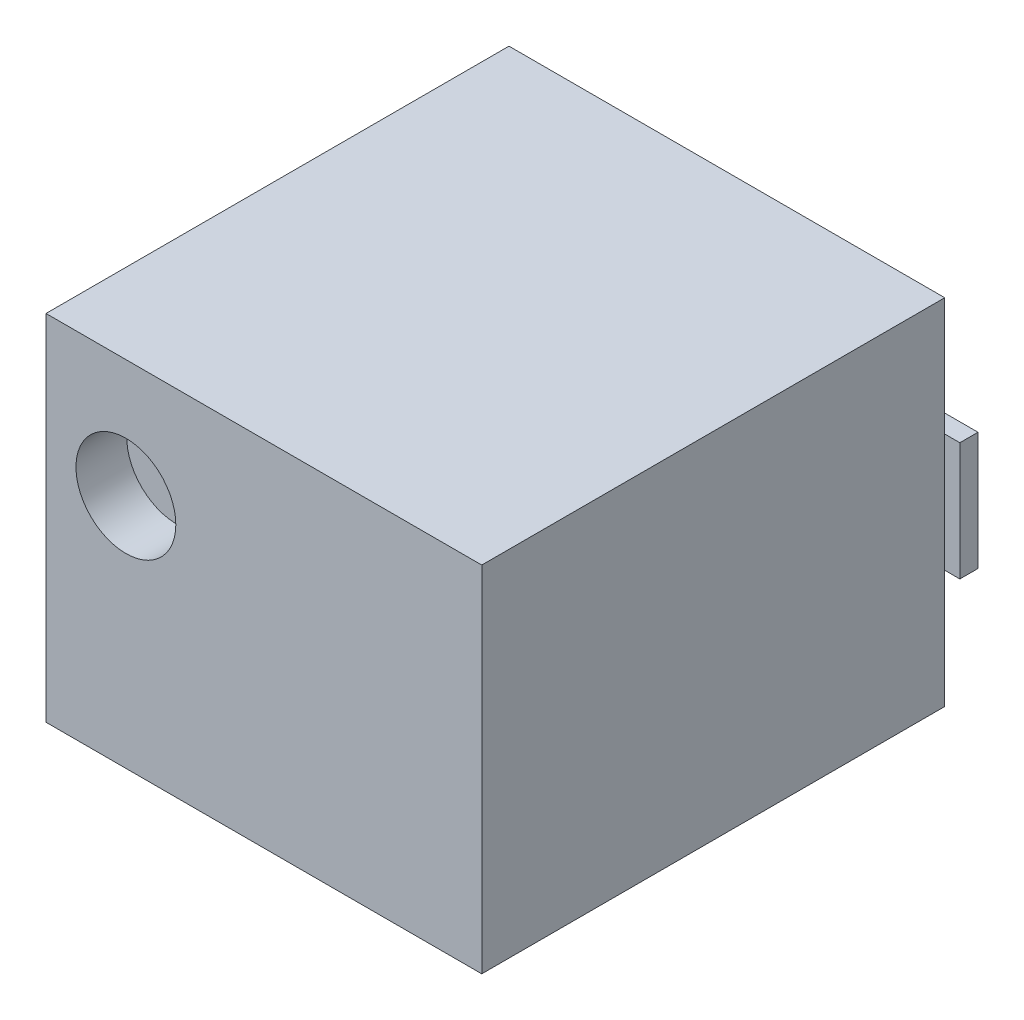
ISO-10303-21;
HEADER;
FILE_DESCRIPTION(('STEP AP214'),'2;1');
FILE_NAME('part.step','',(''),(''),'','','');
FILE_SCHEMA(('AUTOMOTIVE_DESIGN { 1 0 10303 214 1 1 1 1 }'));
ENDSEC;
DATA;
#1=APPLICATION_CONTEXT('core data for automotive mechanical design processes');
#2=APPLICATION_PROTOCOL_DEFINITION('international standard','automotive_design',2000,#1);
#3=PRODUCT_CONTEXT('',#1,'mechanical');
#4=PRODUCT('Part','Part','',(#3));
#5=PRODUCT_RELATED_PRODUCT_CATEGORY('part','',(#4));
#6=PRODUCT_DEFINITION_FORMATION('','',#4);
#7=PRODUCT_DEFINITION_CONTEXT('part definition',#1,'design');
#8=PRODUCT_DEFINITION('design','',#6,#7);
#9=PRODUCT_DEFINITION_SHAPE('','',#8);
#10=(LENGTH_UNIT() NAMED_UNIT(*) SI_UNIT(.MILLI.,.METRE.));
#11=(NAMED_UNIT(*) PLANE_ANGLE_UNIT() SI_UNIT($,.RADIAN.));
#12=(NAMED_UNIT(*) SI_UNIT($,.STERADIAN.) SOLID_ANGLE_UNIT());
#13=UNCERTAINTY_MEASURE_WITH_UNIT(LENGTH_MEASURE(1.E-05),#10,'distance_accuracy_value','');
#14=(GEOMETRIC_REPRESENTATION_CONTEXT(3) GLOBAL_UNCERTAINTY_ASSIGNED_CONTEXT((#13)) GLOBAL_UNIT_ASSIGNED_CONTEXT((#10,
#11,#12)) REPRESENTATION_CONTEXT('',''));
#15=CARTESIAN_POINT('',(0.,0.,0.));
#16=DIRECTION('',(0.,0.,1.));
#17=DIRECTION('',(1.,0.,0.));
#18=AXIS2_PLACEMENT_3D('',#15,#16,#17);
#19=CARTESIAN_POINT('',(-2.4,1.95,-2.55));
#20=DIRECTION('',(0.,0.,1.));
#21=DIRECTION('',(1.,0.,0.));
#22=AXIS2_PLACEMENT_3D('',#19,#20,#21);
#23=PLANE('',#22);
#24=DIRECTION('',(-1.,0.,0.));
#25=VECTOR('',#24,1.);
#26=CARTESIAN_POINT('',(-1.58598997089046,-1.6600943338394,-2.55));
#27=LINE('',#26,#25);
#28=CARTESIAN_POINT('',(-1.58598997089046,-1.6600943338394,-2.55));
#29=VERTEX_POINT('',#28);
#30=CARTESIAN_POINT('',(-2.4,-1.6600943338394,-2.55));
#31=VERTEX_POINT('',#30);
#32=EDGE_CURVE('E50',#29,#31,#27,.T.);
#33=ORIENTED_EDGE('',*,*,#32,.F.);
#34=DIRECTION('',(0.,-1.,0.));
#35=VECTOR('',#34,1.);
#36=CARTESIAN_POINT('',(-1.58598997089046,-1.6600943338394,-2.55));
#37=LINE('',#36,#35);
#38=CARTESIAN_POINT('',(-1.58598997089046,-1.05802587905561,-2.55));
#39=VERTEX_POINT('',#38);
#40=EDGE_CURVE('E184',#39,#29,#37,.T.);
#41=ORIENTED_EDGE('',*,*,#40,.F.);
#42=DIRECTION('',(1.,0.,0.));
#43=VECTOR('',#42,1.);
#44=CARTESIAN_POINT('',(-1.58598997089046,-1.05802587905561,-2.55));
#45=LINE('',#44,#43);
#46=CARTESIAN_POINT('',(-2.4,-1.05802587905561,-2.55));
#47=VERTEX_POINT('',#46);
#48=EDGE_CURVE('E580',#47,#39,#45,.T.);
#49=ORIENTED_EDGE('',*,*,#48,.F.);
#50=DIRECTION('',(0.,-1.,0.));
#51=VECTOR('',#50,1.);
#52=CARTESIAN_POINT('',(-2.4,1.95,-2.55));
#53=LINE('',#52,#51);
#54=CARTESIAN_POINT('',(-2.4,1.05802587905561,-2.55));
#55=VERTEX_POINT('',#54);
#56=EDGE_CURVE('E313',#55,#47,#53,.T.);
#57=ORIENTED_EDGE('',*,*,#56,.F.);
#58=DIRECTION('',(-1.,0.,0.));
#59=VECTOR('',#58,1.);
#60=CARTESIAN_POINT('',(-1.58598997089046,1.05802587905561,-2.55));
#61=LINE('',#60,#59);
#62=CARTESIAN_POINT('',(-1.58598997089046,1.05802587905561,-2.55));
#63=VERTEX_POINT('',#62);
#64=EDGE_CURVE('E58',#63,#55,#61,.T.);
#65=ORIENTED_EDGE('',*,*,#64,.F.);
#66=DIRECTION('',(0.,-1.,0.));
#67=VECTOR('',#66,1.);
#68=CARTESIAN_POINT('',(-1.58598997089046,1.6600943338394,-2.55));
#69=LINE('',#68,#67);
#70=CARTESIAN_POINT('',(-1.58598997089046,1.6600943338394,-2.55));
#71=VERTEX_POINT('',#70);
#72=EDGE_CURVE('E189',#71,#63,#69,.T.);
#73=ORIENTED_EDGE('',*,*,#72,.F.);
#74=DIRECTION('',(1.,0.,0.));
#75=VECTOR('',#74,1.);
#76=CARTESIAN_POINT('',(-1.58598997089046,1.6600943338394,-2.55));
#77=LINE('',#76,#75);
#78=CARTESIAN_POINT('',(-2.4,1.6600943338394,-2.55));
#79=VERTEX_POINT('',#78);
#80=EDGE_CURVE('E212',#79,#71,#77,.T.);
#81=ORIENTED_EDGE('',*,*,#80,.F.);
#82=CARTESIAN_POINT('',(-2.4,1.95,-2.55));
#83=VERTEX_POINT('',#82);
#84=EDGE_CURVE('E285',#83,#79,#53,.T.);
#85=ORIENTED_EDGE('',*,*,#84,.F.);
#86=DIRECTION('',(-1.,0.,0.));
#87=VECTOR('',#86,1.);
#88=CARTESIAN_POINT('',(-2.4,1.95,-2.55));
#89=LINE('',#88,#87);
#90=CARTESIAN_POINT('',(2.4,1.95,-2.55));
#91=VERTEX_POINT('',#90);
#92=EDGE_CURVE('E282',#91,#83,#89,.T.);
#93=ORIENTED_EDGE('',*,*,#92,.F.);
#94=DIRECTION('',(0.,-1.,0.));
#95=VECTOR('',#94,1.);
#96=CARTESIAN_POINT('',(2.4,1.95,-2.55));
#97=LINE('',#96,#95);
#98=CARTESIAN_POINT('',(2.4,0.65,-2.55));
#99=VERTEX_POINT('',#98);
#100=EDGE_CURVE('E290',#91,#99,#97,.T.);
#101=ORIENTED_EDGE('',*,*,#100,.T.);
#102=DIRECTION('',(1.,0.,0.));
#103=VECTOR('',#102,1.);
#104=CARTESIAN_POINT('',(2.56637745521359,0.65,-2.55));
#105=LINE('',#104,#103);
#106=CARTESIAN_POINT('',(1.27773970988688,0.65,-2.55));
#107=VERTEX_POINT('',#106);
#108=EDGE_CURVE('E230',#107,#99,#105,.T.);
#109=ORIENTED_EDGE('',*,*,#108,.F.);
#110=DIRECTION('',(0.,1.,0.));
#111=VECTOR('',#110,1.);
#112=CARTESIAN_POINT('',(1.27773970988688,0.65,-2.55));
#113=LINE('',#112,#111);
#114=CARTESIAN_POINT('',(1.27773970988688,-0.65,-2.55));
#115=VERTEX_POINT('',#114);
#116=EDGE_CURVE('E240',#115,#107,#113,.T.);
#117=ORIENTED_EDGE('',*,*,#116,.F.);
#118=DIRECTION('',(-1.,0.,0.));
#119=VECTOR('',#118,1.);
#120=CARTESIAN_POINT('',(2.56637745521359,-0.65,-2.55));
#121=LINE('',#120,#119);
#122=CARTESIAN_POINT('',(2.4,-0.65,-2.55));
#123=VERTEX_POINT('',#122);
#124=EDGE_CURVE('E11',#123,#115,#121,.T.);
#125=ORIENTED_EDGE('',*,*,#124,.F.);
#126=CARTESIAN_POINT('',(2.4,-1.95,-2.55));
#127=VERTEX_POINT('',#126);
#128=EDGE_CURVE('E288',#123,#127,#97,.T.);
#129=ORIENTED_EDGE('',*,*,#128,.T.);
#130=DIRECTION('',(-1.,0.,0.));
#131=VECTOR('',#130,1.);
#132=CARTESIAN_POINT('',(-2.4,-1.95,-2.55));
#133=LINE('',#132,#131);
#134=CARTESIAN_POINT('',(-2.4,-1.95,-2.55));
#135=VERTEX_POINT('',#134);
#136=EDGE_CURVE('E272',#127,#135,#133,.T.);
#137=ORIENTED_EDGE('',*,*,#136,.T.);
#138=EDGE_CURVE('E284',#31,#135,#53,.T.);
#139=ORIENTED_EDGE('',*,*,#138,.F.);
#140=EDGE_LOOP('',(#33,#41,#49,#57,#65,#73,#81,#85,#93,#101,#109,#117,#125,#129,#137,#139));
#141=FACE_BOUND('',#140,.T.);
#142=ADVANCED_FACE('F33',(#141),#23,.F.);
#143=CARTESIAN_POINT('',(-2.4,1.95,-2.55));
#144=DIRECTION('',(1.,0.,0.));
#145=DIRECTION('',(0.,0.,-1.));
#146=AXIS2_PLACEMENT_3D('',#143,#144,#145);
#147=PLANE('',#146);
#148=ORIENTED_EDGE('',*,*,#84,.T.);
#149=EDGE_CURVE('E289',#79,#55,#53,.T.);
#150=ORIENTED_EDGE('',*,*,#149,.T.);
#151=ORIENTED_EDGE('',*,*,#56,.T.);
#152=EDGE_CURVE('E311',#47,#31,#53,.T.);
#153=ORIENTED_EDGE('',*,*,#152,.T.);
#154=ORIENTED_EDGE('',*,*,#138,.T.);
#155=DIRECTION('',(0.,0.,1.));
#156=VECTOR('',#155,1.);
#157=CARTESIAN_POINT('',(-2.4,-1.95,-2.55));
#158=LINE('',#157,#156);
#159=CARTESIAN_POINT('',(-2.4,-1.95,2.55));
#160=VERTEX_POINT('',#159);
#161=EDGE_CURVE('E261',#135,#160,#158,.T.);
#162=ORIENTED_EDGE('',*,*,#161,.T.);
#163=DIRECTION('',(0.,-1.,0.));
#164=VECTOR('',#163,1.);
#165=CARTESIAN_POINT('',(-2.4,1.95,2.55));
#166=LINE('',#165,#164);
#167=CARTESIAN_POINT('',(-2.4,1.95,2.55));
#168=VERTEX_POINT('',#167);
#169=EDGE_CURVE('E37',#168,#160,#166,.T.);
#170=ORIENTED_EDGE('',*,*,#169,.F.);
#171=DIRECTION('',(0.,0.,1.));
#172=VECTOR('',#171,1.);
#173=CARTESIAN_POINT('',(-2.4,1.95,-2.55));
#174=LINE('',#173,#172);
#175=EDGE_CURVE('E275',#83,#168,#174,.T.);
#176=ORIENTED_EDGE('',*,*,#175,.F.);
#177=EDGE_LOOP('',(#148,#150,#151,#153,#154,#162,#170,#176));
#178=FACE_BOUND('',#177,.T.);
#179=ADVANCED_FACE('F35',(#178),#147,.F.);
#180=CARTESIAN_POINT('',(-2.4,1.95,2.55));
#181=DIRECTION('',(0.,0.,-1.));
#182=DIRECTION('',(-1.,0.,0.));
#183=AXIS2_PLACEMENT_3D('',#180,#181,#182);
#184=PLANE('',#183);
#185=CARTESIAN_POINT('',(-1.52,0.65,2.55));
#186=DIRECTION('',(0.,0.,1.));
#187=DIRECTION('',(1.,0.,0.));
#188=AXIS2_PLACEMENT_3D('',#185,#186,#187);
#189=CIRCLE('',#188,0.55);
#190=CARTESIAN_POINT('',(-0.969999999999999,0.65,2.55));
#191=VERTEX_POINT('',#190);
#192=EDGE_CURVE('E257',#191,#191,#189,.T.);
#193=ORIENTED_EDGE('',*,*,#192,.F.);
#194=EDGE_LOOP('',(#193));
#195=FACE_BOUND('',#194,.T.);
#196=ORIENTED_EDGE('',*,*,#169,.T.);
#197=DIRECTION('',(1.,0.,0.));
#198=VECTOR('',#197,1.);
#199=CARTESIAN_POINT('',(-2.4,-1.95,2.55));
#200=LINE('',#199,#198);
#201=CARTESIAN_POINT('',(2.40000000000002,-1.95,2.55));
#202=VERTEX_POINT('',#201);
#203=EDGE_CURVE('E266',#160,#202,#200,.T.);
#204=ORIENTED_EDGE('',*,*,#203,.T.);
#205=DIRECTION('',(0.,-1.,0.));
#206=VECTOR('',#205,1.);
#207=CARTESIAN_POINT('',(2.40000000000002,1.95,2.55));
#208=LINE('',#207,#206);
#209=CARTESIAN_POINT('',(2.40000000000002,1.95,2.55));
#210=VERTEX_POINT('',#209);
#211=EDGE_CURVE('E292',#210,#202,#208,.T.);
#212=ORIENTED_EDGE('',*,*,#211,.F.);
#213=DIRECTION('',(1.,0.,0.));
#214=VECTOR('',#213,1.);
#215=CARTESIAN_POINT('',(-2.4,1.95,2.55));
#216=LINE('',#215,#214);
#217=EDGE_CURVE('E278',#168,#210,#216,.T.);
#218=ORIENTED_EDGE('',*,*,#217,.F.);
#219=EDGE_LOOP('',(#196,#204,#212,#218));
#220=FACE_BOUND('',#219,.T.);
#221=ADVANCED_FACE('F301',(#195,#220),#184,.F.);
#222=CARTESIAN_POINT('',(2.4,1.95,-2.55));
#223=DIRECTION('',(-1.,0.,0.));
#224=DIRECTION('',(0.,0.,1.));
#225=AXIS2_PLACEMENT_3D('',#222,#223,#224);
#226=PLANE('',#225);
#227=ORIENTED_EDGE('',*,*,#211,.T.);
#228=DIRECTION('',(0.,0.,-1.));
#229=VECTOR('',#228,1.);
#230=CARTESIAN_POINT('',(2.4,-1.95,-2.55));
#231=LINE('',#230,#229);
#232=EDGE_CURVE('E269',#202,#127,#231,.T.);
#233=ORIENTED_EDGE('',*,*,#232,.T.);
#234=ORIENTED_EDGE('',*,*,#128,.F.);
#235=EDGE_CURVE('E293',#99,#123,#97,.T.);
#236=ORIENTED_EDGE('',*,*,#235,.F.);
#237=ORIENTED_EDGE('',*,*,#100,.F.);
#238=DIRECTION('',(0.,0.,-1.));
#239=VECTOR('',#238,1.);
#240=CARTESIAN_POINT('',(2.4,1.95,-2.55));
#241=LINE('',#240,#239);
#242=EDGE_CURVE('E280',#210,#91,#241,.T.);
#243=ORIENTED_EDGE('',*,*,#242,.F.);
#244=EDGE_LOOP('',(#227,#233,#234,#236,#237,#243));
#245=FACE_BOUND('',#244,.T.);
#246=ADVANCED_FACE('F358',(#245),#226,.F.);
#247=CARTESIAN_POINT('',(-2.4,1.95,2.55));
#248=DIRECTION('',(0.,1.,0.));
#249=DIRECTION('',(0.,0.,1.));
#250=AXIS2_PLACEMENT_3D('',#247,#248,#249);
#251=PLANE('',#250);
#252=ORIENTED_EDGE('',*,*,#175,.T.);
#253=ORIENTED_EDGE('',*,*,#217,.T.);
#254=ORIENTED_EDGE('',*,*,#242,.T.);
#255=ORIENTED_EDGE('',*,*,#92,.T.);
#256=EDGE_LOOP('',(#252,#253,#254,#255));
#257=FACE_BOUND('',#256,.T.);
#258=ADVANCED_FACE('F356',(#257),#251,.T.);
#259=CARTESIAN_POINT('',(-2.4,-1.95,2.55));
#260=DIRECTION('',(0.,1.,0.));
#261=DIRECTION('',(0.,0.,1.));
#262=AXIS2_PLACEMENT_3D('',#259,#260,#261);
#263=PLANE('',#262);
#264=ORIENTED_EDGE('',*,*,#161,.F.);
#265=ORIENTED_EDGE('',*,*,#136,.F.);
#266=ORIENTED_EDGE('',*,*,#232,.F.);
#267=ORIENTED_EDGE('',*,*,#203,.F.);
#268=EDGE_LOOP('',(#264,#265,#266,#267));
#269=FACE_BOUND('',#268,.T.);
#270=ADVANCED_FACE('F306',(#269),#263,.F.);
#271=CARTESIAN_POINT('',(-1.52,0.65,1.99));
#272=DIRECTION('',(0.,0.,1.));
#273=DIRECTION('',(1.,0.,0.));
#274=AXIS2_PLACEMENT_3D('',#271,#272,#273);
#275=CYLINDRICAL_SURFACE('',#274,0.55);
#276=CARTESIAN_POINT('',(-1.52,0.65,1.99));
#277=DIRECTION('',(0.,0.,1.));
#278=DIRECTION('',(1.,0.,0.));
#279=AXIS2_PLACEMENT_3D('',#276,#277,#278);
#280=CIRCLE('',#279,0.55);
#281=CARTESIAN_POINT('',(-0.969999999999999,0.65,1.99));
#282=VERTEX_POINT('',#281);
#283=EDGE_CURVE('E258',#282,#282,#280,.T.);
#284=ORIENTED_EDGE('',*,*,#283,.F.);
#285=EDGE_LOOP('',(#284));
#286=FACE_BOUND('',#285,.T.);
#287=ORIENTED_EDGE('',*,*,#192,.T.);
#288=EDGE_LOOP('',(#287));
#289=FACE_BOUND('',#288,.T.);
#290=ADVANCED_FACE('F368',(#286,#289),#275,.F.);
#291=CARTESIAN_POINT('',(-1.52,0.65,1.99));
#292=DIRECTION('',(0.,0.,1.));
#293=DIRECTION('',(1.,0.,0.));
#294=AXIS2_PLACEMENT_3D('',#291,#292,#293);
#295=PLANE('',#294);
#296=ORIENTED_EDGE('',*,*,#283,.T.);
#297=EDGE_LOOP('',(#296));
#298=FACE_BOUND('',#297,.T.);
#299=ADVANCED_FACE('F370',(#298),#295,.T.);
#300=CARTESIAN_POINT('',(0.,0.,-2.55));
#301=DIRECTION('',(0.,0.,-1.));
#302=DIRECTION('',(-1.,0.,0.));
#303=AXIS2_PLACEMENT_3D('',#300,#301,#302);
#304=PLANE('',#303);
#305=CARTESIAN_POINT('',(2.56637745521359,0.65,-2.55));
#306=VERTEX_POINT('',#305);
#307=EDGE_CURVE('E243',#99,#306,#105,.T.);
#308=ORIENTED_EDGE('',*,*,#307,.F.);
#309=ORIENTED_EDGE('',*,*,#235,.T.);
#310=CARTESIAN_POINT('',(2.56637745521359,-0.65,-2.55));
#311=VERTEX_POINT('',#310);
#312=EDGE_CURVE('E43',#311,#123,#121,.T.);
#313=ORIENTED_EDGE('',*,*,#312,.F.);
#314=DIRECTION('',(0.,-1.,0.));
#315=VECTOR('',#314,1.);
#316=CARTESIAN_POINT('',(2.56637745521359,0.65,-2.55));
#317=LINE('',#316,#315);
#318=EDGE_CURVE('E225',#306,#311,#317,.T.);
#319=ORIENTED_EDGE('',*,*,#318,.F.);
#320=EDGE_LOOP('',(#308,#309,#313,#319));
#321=FACE_BOUND('',#320,.T.);
#322=ADVANCED_FACE('F377',(#321),#304,.F.);
#323=CARTESIAN_POINT('',(2.56637745521359,0.65,-2.75));
#324=DIRECTION('',(-1.,0.,0.));
#325=DIRECTION('',(0.,0.,1.));
#326=AXIS2_PLACEMENT_3D('',#323,#324,#325);
#327=PLANE('',#326);
#328=ORIENTED_EDGE('',*,*,#318,.T.);
#329=DIRECTION('',(0.,0.,1.));
#330=VECTOR('',#329,1.);
#331=CARTESIAN_POINT('',(2.56637745521359,-0.65,-2.75));
#332=LINE('',#331,#330);
#333=CARTESIAN_POINT('',(2.56637745521359,-0.65,-2.75));
#334=VERTEX_POINT('',#333);
#335=EDGE_CURVE('E254',#334,#311,#332,.T.);
#336=ORIENTED_EDGE('',*,*,#335,.F.);
#337=DIRECTION('',(0.,-1.,0.));
#338=VECTOR('',#337,1.);
#339=CARTESIAN_POINT('',(2.56637745521359,0.65,-2.75));
#340=LINE('',#339,#338);
#341=CARTESIAN_POINT('',(2.56637745521359,0.65,-2.75));
#342=VERTEX_POINT('',#341);
#343=EDGE_CURVE('E226',#342,#334,#340,.T.);
#344=ORIENTED_EDGE('',*,*,#343,.F.);
#345=DIRECTION('',(0.,0.,1.));
#346=VECTOR('',#345,1.);
#347=CARTESIAN_POINT('',(2.56637745521359,0.65,-2.75));
#348=LINE('',#347,#346);
#349=EDGE_CURVE('E236',#342,#306,#348,.T.);
#350=ORIENTED_EDGE('',*,*,#349,.T.);
#351=EDGE_LOOP('',(#328,#336,#344,#350));
#352=FACE_BOUND('',#351,.T.);
#353=ADVANCED_FACE('F382',(#352),#327,.F.);
#354=CARTESIAN_POINT('',(2.56637745521359,-0.65,-2.75));
#355=DIRECTION('',(0.,1.,0.));
#356=DIRECTION('',(0.,0.,1.));
#357=AXIS2_PLACEMENT_3D('',#354,#355,#356);
#358=PLANE('',#357);
#359=ORIENTED_EDGE('',*,*,#312,.T.);
#360=ORIENTED_EDGE('',*,*,#124,.T.);
#361=DIRECTION('',(0.,0.,1.));
#362=VECTOR('',#361,1.);
#363=CARTESIAN_POINT('',(1.27773970988688,-0.65,-2.75));
#364=LINE('',#363,#362);
#365=CARTESIAN_POINT('',(1.27773970988688,-0.65,-2.75));
#366=VERTEX_POINT('',#365);
#367=EDGE_CURVE('E251',#366,#115,#364,.T.);
#368=ORIENTED_EDGE('',*,*,#367,.F.);
#369=DIRECTION('',(-1.,0.,0.));
#370=VECTOR('',#369,1.);
#371=CARTESIAN_POINT('',(2.56637745521359,-0.65,-2.75));
#372=LINE('',#371,#370);
#373=EDGE_CURVE('E229',#334,#366,#372,.T.);
#374=ORIENTED_EDGE('',*,*,#373,.F.);
#375=ORIENTED_EDGE('',*,*,#335,.T.);
#376=EDGE_LOOP('',(#359,#360,#368,#374,#375));
#377=FACE_BOUND('',#376,.T.);
#378=ADVANCED_FACE('F385',(#377),#358,.F.);
#379=CARTESIAN_POINT('',(1.27773970988688,0.65,-2.75));
#380=DIRECTION('',(1.,0.,0.));
#381=DIRECTION('',(0.,0.,-1.));
#382=AXIS2_PLACEMENT_3D('',#379,#380,#381);
#383=PLANE('',#382);
#384=ORIENTED_EDGE('',*,*,#116,.T.);
#385=DIRECTION('',(0.,0.,1.));
#386=VECTOR('',#385,1.);
#387=CARTESIAN_POINT('',(1.27773970988688,0.65,-2.75));
#388=LINE('',#387,#386);
#389=CARTESIAN_POINT('',(1.27773970988688,0.65,-2.75));
#390=VERTEX_POINT('',#389);
#391=EDGE_CURVE('E248',#390,#107,#388,.T.);
#392=ORIENTED_EDGE('',*,*,#391,.F.);
#393=DIRECTION('',(0.,1.,0.));
#394=VECTOR('',#393,1.);
#395=CARTESIAN_POINT('',(1.27773970988688,0.65,-2.75));
#396=LINE('',#395,#394);
#397=EDGE_CURVE('E232',#366,#390,#396,.T.);
#398=ORIENTED_EDGE('',*,*,#397,.F.);
#399=ORIENTED_EDGE('',*,*,#367,.T.);
#400=EDGE_LOOP('',(#384,#392,#398,#399));
#401=FACE_BOUND('',#400,.T.);
#402=ADVANCED_FACE('F389',(#401),#383,.F.);
#403=CARTESIAN_POINT('',(2.56637745521359,0.65,-2.75));
#404=DIRECTION('',(0.,-1.,0.));
#405=DIRECTION('',(0.,0.,-1.));
#406=AXIS2_PLACEMENT_3D('',#403,#404,#405);
#407=PLANE('',#406);
#408=ORIENTED_EDGE('',*,*,#108,.T.);
#409=ORIENTED_EDGE('',*,*,#307,.T.);
#410=ORIENTED_EDGE('',*,*,#349,.F.);
#411=DIRECTION('',(1.,0.,0.));
#412=VECTOR('',#411,1.);
#413=CARTESIAN_POINT('',(2.56637745521359,0.65,-2.75));
#414=LINE('',#413,#412);
#415=EDGE_CURVE('E234',#390,#342,#414,.T.);
#416=ORIENTED_EDGE('',*,*,#415,.F.);
#417=ORIENTED_EDGE('',*,*,#391,.T.);
#418=EDGE_LOOP('',(#408,#409,#410,#416,#417));
#419=FACE_BOUND('',#418,.T.);
#420=ADVANCED_FACE('F393',(#419),#407,.F.);
#421=CARTESIAN_POINT('',(0.,0.,-2.75));
#422=DIRECTION('',(0.,0.,-1.));
#423=DIRECTION('',(-1.,0.,0.));
#424=AXIS2_PLACEMENT_3D('',#421,#422,#423);
#425=PLANE('',#424);
#426=ORIENTED_EDGE('',*,*,#343,.T.);
#427=ORIENTED_EDGE('',*,*,#373,.T.);
#428=ORIENTED_EDGE('',*,*,#397,.T.);
#429=ORIENTED_EDGE('',*,*,#415,.T.);
#430=EDGE_LOOP('',(#426,#427,#428,#429));
#431=FACE_BOUND('',#430,.T.);
#432=ADVANCED_FACE('F397',(#431),#425,.T.);
#433=CARTESIAN_POINT('',(0.,0.,-2.55));
#434=DIRECTION('',(0.,0.,-1.));
#435=DIRECTION('',(-1.,0.,0.));
#436=AXIS2_PLACEMENT_3D('',#433,#434,#435);
#437=PLANE('',#436);
#438=CARTESIAN_POINT('',(-2.6,1.05802587905561,-2.55));
#439=VERTEX_POINT('',#438);
#440=EDGE_CURVE('E192',#55,#439,#61,.T.);
#441=ORIENTED_EDGE('',*,*,#440,.F.);
#442=ORIENTED_EDGE('',*,*,#149,.F.);
#443=CARTESIAN_POINT('',(-2.6,1.6600943338394,-2.55));
#444=VERTEX_POINT('',#443);
#445=EDGE_CURVE('E202',#444,#79,#77,.T.);
#446=ORIENTED_EDGE('',*,*,#445,.F.);
#447=DIRECTION('',(0.,1.,0.));
#448=VECTOR('',#447,1.);
#449=CARTESIAN_POINT('',(-2.6,1.6600943338394,-2.55));
#450=LINE('',#449,#448);
#451=EDGE_CURVE('E210',#439,#444,#450,.T.);
#452=ORIENTED_EDGE('',*,*,#451,.F.);
#453=EDGE_LOOP('',(#441,#442,#446,#452));
#454=FACE_BOUND('',#453,.T.);
#455=ADVANCED_FACE('F319',(#454),#437,.F.);
#456=CARTESIAN_POINT('',(-1.58598997089046,1.6600943338394,-2.75));
#457=DIRECTION('',(-1.,0.,0.));
#458=DIRECTION('',(0.,0.,1.));
#459=AXIS2_PLACEMENT_3D('',#456,#457,#458);
#460=PLANE('',#459);
#461=ORIENTED_EDGE('',*,*,#72,.T.);
#462=DIRECTION('',(0.,0.,1.));
#463=VECTOR('',#462,1.);
#464=CARTESIAN_POINT('',(-1.58598997089046,1.05802587905561,-2.75));
#465=LINE('',#464,#463);
#466=CARTESIAN_POINT('',(-1.58598997089046,1.05802587905561,-2.75));
#467=VERTEX_POINT('',#466);
#468=EDGE_CURVE('E223',#467,#63,#465,.T.);
#469=ORIENTED_EDGE('',*,*,#468,.F.);
#470=DIRECTION('',(0.,-1.,0.));
#471=VECTOR('',#470,1.);
#472=CARTESIAN_POINT('',(-1.58598997089046,1.6600943338394,-2.75));
#473=LINE('',#472,#471);
#474=CARTESIAN_POINT('',(-1.58598997089046,1.6600943338394,-2.75));
#475=VERTEX_POINT('',#474);
#476=EDGE_CURVE('E198',#475,#467,#473,.T.);
#477=ORIENTED_EDGE('',*,*,#476,.F.);
#478=DIRECTION('',(0.,0.,1.));
#479=VECTOR('',#478,1.);
#480=CARTESIAN_POINT('',(-1.58598997089046,1.6600943338394,-2.75));
#481=LINE('',#480,#479);
#482=EDGE_CURVE('E207',#475,#71,#481,.T.);
#483=ORIENTED_EDGE('',*,*,#482,.T.);
#484=EDGE_LOOP('',(#461,#469,#477,#483));
#485=FACE_BOUND('',#484,.T.);
#486=ADVANCED_FACE('F331',(#485),#460,.F.);
#487=CARTESIAN_POINT('',(-1.58598997089046,1.05802587905561,-2.75));
#488=DIRECTION('',(0.,1.,0.));
#489=DIRECTION('',(0.,0.,1.));
#490=AXIS2_PLACEMENT_3D('',#487,#488,#489);
#491=PLANE('',#490);
#492=ORIENTED_EDGE('',*,*,#64,.T.);
#493=ORIENTED_EDGE('',*,*,#440,.T.);
#494=DIRECTION('',(0.,0.,1.));
#495=VECTOR('',#494,1.);
#496=CARTESIAN_POINT('',(-2.6,1.05802587905561,-2.75));
#497=LINE('',#496,#495);
#498=CARTESIAN_POINT('',(-2.6,1.05802587905561,-2.75));
#499=VERTEX_POINT('',#498);
#500=EDGE_CURVE('E220',#499,#439,#497,.T.);
#501=ORIENTED_EDGE('',*,*,#500,.F.);
#502=DIRECTION('',(-1.,0.,0.));
#503=VECTOR('',#502,1.);
#504=CARTESIAN_POINT('',(-1.58598997089046,1.05802587905561,-2.75));
#505=LINE('',#504,#503);
#506=EDGE_CURVE('E201',#467,#499,#505,.T.);
#507=ORIENTED_EDGE('',*,*,#506,.F.);
#508=ORIENTED_EDGE('',*,*,#468,.T.);
#509=EDGE_LOOP('',(#492,#493,#501,#507,#508));
#510=FACE_BOUND('',#509,.T.);
#511=ADVANCED_FACE('F339',(#510),#491,.F.);
#512=CARTESIAN_POINT('',(-2.6,1.6600943338394,-2.75));
#513=DIRECTION('',(1.,0.,0.));
#514=DIRECTION('',(0.,0.,-1.));
#515=AXIS2_PLACEMENT_3D('',#512,#513,#514);
#516=PLANE('',#515);
#517=ORIENTED_EDGE('',*,*,#451,.T.);
#518=DIRECTION('',(0.,0.,1.));
#519=VECTOR('',#518,1.);
#520=CARTESIAN_POINT('',(-2.6,1.6600943338394,-2.75));
#521=LINE('',#520,#519);
#522=CARTESIAN_POINT('',(-2.6,1.6600943338394,-2.75));
#523=VERTEX_POINT('',#522);
#524=EDGE_CURVE('E217',#523,#444,#521,.T.);
#525=ORIENTED_EDGE('',*,*,#524,.F.);
#526=DIRECTION('',(0.,1.,0.));
#527=VECTOR('',#526,1.);
#528=CARTESIAN_POINT('',(-2.6,1.6600943338394,-2.75));
#529=LINE('',#528,#527);
#530=EDGE_CURVE('E204',#499,#523,#529,.T.);
#531=ORIENTED_EDGE('',*,*,#530,.F.);
#532=ORIENTED_EDGE('',*,*,#500,.T.);
#533=EDGE_LOOP('',(#517,#525,#531,#532));
#534=FACE_BOUND('',#533,.T.);
#535=ADVANCED_FACE('F338',(#534),#516,.F.);
#536=CARTESIAN_POINT('',(-1.58598997089046,1.6600943338394,-2.75));
#537=DIRECTION('',(0.,-1.,0.));
#538=DIRECTION('',(0.,0.,-1.));
#539=AXIS2_PLACEMENT_3D('',#536,#537,#538);
#540=PLANE('',#539);
#541=ORIENTED_EDGE('',*,*,#445,.T.);
#542=ORIENTED_EDGE('',*,*,#80,.T.);
#543=ORIENTED_EDGE('',*,*,#482,.F.);
#544=DIRECTION('',(1.,0.,0.));
#545=VECTOR('',#544,1.);
#546=CARTESIAN_POINT('',(-1.58598997089046,1.6600943338394,-2.75));
#547=LINE('',#546,#545);
#548=EDGE_CURVE('E206',#523,#475,#547,.T.);
#549=ORIENTED_EDGE('',*,*,#548,.F.);
#550=ORIENTED_EDGE('',*,*,#524,.T.);
#551=EDGE_LOOP('',(#541,#542,#543,#549,#550));
#552=FACE_BOUND('',#551,.T.);
#553=ADVANCED_FACE('F323',(#552),#540,.F.);
#554=CARTESIAN_POINT('',(0.,0.,-2.75));
#555=DIRECTION('',(0.,0.,-1.));
#556=DIRECTION('',(-1.,0.,0.));
#557=AXIS2_PLACEMENT_3D('',#554,#555,#556);
#558=PLANE('',#557);
#559=ORIENTED_EDGE('',*,*,#476,.T.);
#560=ORIENTED_EDGE('',*,*,#506,.T.);
#561=ORIENTED_EDGE('',*,*,#530,.T.);
#562=ORIENTED_EDGE('',*,*,#548,.T.);
#563=EDGE_LOOP('',(#559,#560,#561,#562));
#564=FACE_BOUND('',#563,.T.);
#565=ADVANCED_FACE('F334',(#564),#558,.T.);
#566=CARTESIAN_POINT('',(0.,0.,-2.55));
#567=DIRECTION('',(0.,0.,-1.));
#568=DIRECTION('',(-1.,0.,0.));
#569=AXIS2_PLACEMENT_3D('',#566,#567,#568);
#570=PLANE('',#569);
#571=CARTESIAN_POINT('',(-2.6,-1.6600943338394,-2.55));
#572=VERTEX_POINT('',#571);
#573=EDGE_CURVE('E187',#31,#572,#27,.T.);
#574=ORIENTED_EDGE('',*,*,#573,.F.);
#575=ORIENTED_EDGE('',*,*,#152,.F.);
#576=CARTESIAN_POINT('',(-2.6,-1.05802587905561,-2.55));
#577=VERTEX_POINT('',#576);
#578=EDGE_CURVE('E575',#577,#47,#45,.T.);
#579=ORIENTED_EDGE('',*,*,#578,.F.);
#580=DIRECTION('',(0.,1.,0.));
#581=VECTOR('',#580,1.);
#582=CARTESIAN_POINT('',(-2.6,-1.6600943338394,-2.55));
#583=LINE('',#582,#581);
#584=EDGE_CURVE('E578',#572,#577,#583,.T.);
#585=ORIENTED_EDGE('',*,*,#584,.F.);
#586=EDGE_LOOP('',(#574,#575,#579,#585));
#587=FACE_BOUND('',#586,.T.);
#588=ADVANCED_FACE('F513',(#587),#570,.F.);
#589=CARTESIAN_POINT('',(-1.58598997089046,-1.6600943338394,-2.75));
#590=DIRECTION('',(0.,1.,0.));
#591=DIRECTION('',(0.,0.,1.));
#592=AXIS2_PLACEMENT_3D('',#589,#590,#591);
#593=PLANE('',#592);
#594=ORIENTED_EDGE('',*,*,#32,.T.);
#595=ORIENTED_EDGE('',*,*,#573,.T.);
#596=DIRECTION('',(0.,0.,1.));
#597=VECTOR('',#596,1.);
#598=CARTESIAN_POINT('',(-2.6,-1.6600943338394,-2.75));
#599=LINE('',#598,#597);
#600=CARTESIAN_POINT('',(-2.6,-1.6600943338394,-2.75));
#601=VERTEX_POINT('',#600);
#602=EDGE_CURVE('E171',#601,#572,#599,.T.);
#603=ORIENTED_EDGE('',*,*,#602,.F.);
#604=DIRECTION('',(-1.,0.,0.));
#605=VECTOR('',#604,1.);
#606=CARTESIAN_POINT('',(-1.58598997089046,-1.6600943338394,-2.75));
#607=LINE('',#606,#605);
#608=CARTESIAN_POINT('',(-1.58598997089046,-1.6600943338394,-2.75));
#609=VERTEX_POINT('',#608);
#610=EDGE_CURVE('E177',#609,#601,#607,.T.);
#611=ORIENTED_EDGE('',*,*,#610,.F.);
#612=DIRECTION('',(0.,0.,1.));
#613=VECTOR('',#612,1.);
#614=CARTESIAN_POINT('',(-1.58598997089046,-1.6600943338394,-2.75));
#615=LINE('',#614,#613);
#616=EDGE_CURVE('E572',#609,#29,#615,.T.);
#617=ORIENTED_EDGE('',*,*,#616,.T.);
#618=EDGE_LOOP('',(#594,#595,#603,#611,#617));
#619=FACE_BOUND('',#618,.T.);
#620=ADVANCED_FACE('F186',(#619),#593,.F.);
#621=CARTESIAN_POINT('',(-2.6,-1.6600943338394,-2.75));
#622=DIRECTION('',(1.,0.,0.));
#623=DIRECTION('',(0.,0.,-1.));
#624=AXIS2_PLACEMENT_3D('',#621,#622,#623);
#625=PLANE('',#624);
#626=ORIENTED_EDGE('',*,*,#584,.T.);
#627=DIRECTION('',(0.,0.,1.));
#628=VECTOR('',#627,1.);
#629=CARTESIAN_POINT('',(-2.6,-1.05802587905561,-2.75));
#630=LINE('',#629,#628);
#631=CARTESIAN_POINT('',(-2.6,-1.05802587905561,-2.75));
#632=VERTEX_POINT('',#631);
#633=EDGE_CURVE('E173',#632,#577,#630,.T.);
#634=ORIENTED_EDGE('',*,*,#633,.F.);
#635=DIRECTION('',(0.,1.,0.));
#636=VECTOR('',#635,1.);
#637=CARTESIAN_POINT('',(-2.6,-1.6600943338394,-2.75));
#638=LINE('',#637,#636);
#639=EDGE_CURVE('E167',#601,#632,#638,.T.);
#640=ORIENTED_EDGE('',*,*,#639,.F.);
#641=ORIENTED_EDGE('',*,*,#602,.T.);
#642=EDGE_LOOP('',(#626,#634,#640,#641));
#643=FACE_BOUND('',#642,.T.);
#644=ADVANCED_FACE('F169',(#643),#625,.F.);
#645=CARTESIAN_POINT('',(-1.58598997089046,-1.05802587905561,-2.75));
#646=DIRECTION('',(0.,-1.,0.));
#647=DIRECTION('',(0.,0.,-1.));
#648=AXIS2_PLACEMENT_3D('',#645,#646,#647);
#649=PLANE('',#648);
#650=ORIENTED_EDGE('',*,*,#578,.T.);
#651=ORIENTED_EDGE('',*,*,#48,.T.);
#652=DIRECTION('',(0.,0.,1.));
#653=VECTOR('',#652,1.);
#654=CARTESIAN_POINT('',(-1.58598997089046,-1.05802587905561,-2.75));
#655=LINE('',#654,#653);
#656=CARTESIAN_POINT('',(-1.58598997089046,-1.05802587905561,-2.75));
#657=VERTEX_POINT('',#656);
#658=EDGE_CURVE('E194',#657,#39,#655,.T.);
#659=ORIENTED_EDGE('',*,*,#658,.F.);
#660=DIRECTION('',(1.,0.,0.));
#661=VECTOR('',#660,1.);
#662=CARTESIAN_POINT('',(-1.58598997089046,-1.05802587905561,-2.75));
#663=LINE('',#662,#661);
#664=EDGE_CURVE('E176',#632,#657,#663,.T.);
#665=ORIENTED_EDGE('',*,*,#664,.F.);
#666=ORIENTED_EDGE('',*,*,#633,.T.);
#667=EDGE_LOOP('',(#650,#651,#659,#665,#666));
#668=FACE_BOUND('',#667,.T.);
#669=ADVANCED_FACE('F539',(#668),#649,.F.);
#670=CARTESIAN_POINT('',(-1.58598997089046,-1.6600943338394,-2.75));
#671=DIRECTION('',(-1.,0.,0.));
#672=DIRECTION('',(0.,0.,1.));
#673=AXIS2_PLACEMENT_3D('',#670,#671,#672);
#674=PLANE('',#673);
#675=ORIENTED_EDGE('',*,*,#40,.T.);
#676=ORIENTED_EDGE('',*,*,#616,.F.);
#677=DIRECTION('',(0.,-1.,0.));
#678=VECTOR('',#677,1.);
#679=CARTESIAN_POINT('',(-1.58598997089046,-1.6600943338394,-2.75));
#680=LINE('',#679,#678);
#681=EDGE_CURVE('E182',#657,#609,#680,.T.);
#682=ORIENTED_EDGE('',*,*,#681,.F.);
#683=ORIENTED_EDGE('',*,*,#658,.T.);
#684=EDGE_LOOP('',(#675,#676,#682,#683));
#685=FACE_BOUND('',#684,.T.);
#686=ADVANCED_FACE('F548',(#685),#674,.F.);
#687=CARTESIAN_POINT('',(0.,0.,-2.75));
#688=DIRECTION('',(0.,0.,-1.));
#689=DIRECTION('',(-1.,0.,0.));
#690=AXIS2_PLACEMENT_3D('',#687,#688,#689);
#691=PLANE('',#690);
#692=ORIENTED_EDGE('',*,*,#610,.T.);
#693=ORIENTED_EDGE('',*,*,#639,.T.);
#694=ORIENTED_EDGE('',*,*,#664,.T.);
#695=ORIENTED_EDGE('',*,*,#681,.T.);
#696=EDGE_LOOP('',(#692,#693,#694,#695));
#697=FACE_BOUND('',#696,.T.);
#698=ADVANCED_FACE('F180',(#697),#691,.T.);
#699=CLOSED_SHELL('',(#142,#179,#221,#246,#258,#270,#290,#299,#322,#353,#378,#402,#420,#432,
#455,#486,#511,#535,#553,#565,#588,#620,#644,#669,#686,#698));
#700=MANIFOLD_SOLID_BREP('B2',#699);
#701=ADVANCED_BREP_SHAPE_REPRESENTATION('',(#18,#700),#14);
#702=SHAPE_DEFINITION_REPRESENTATION(#9,#701);
ENDSEC;
END-ISO-10303-21;
